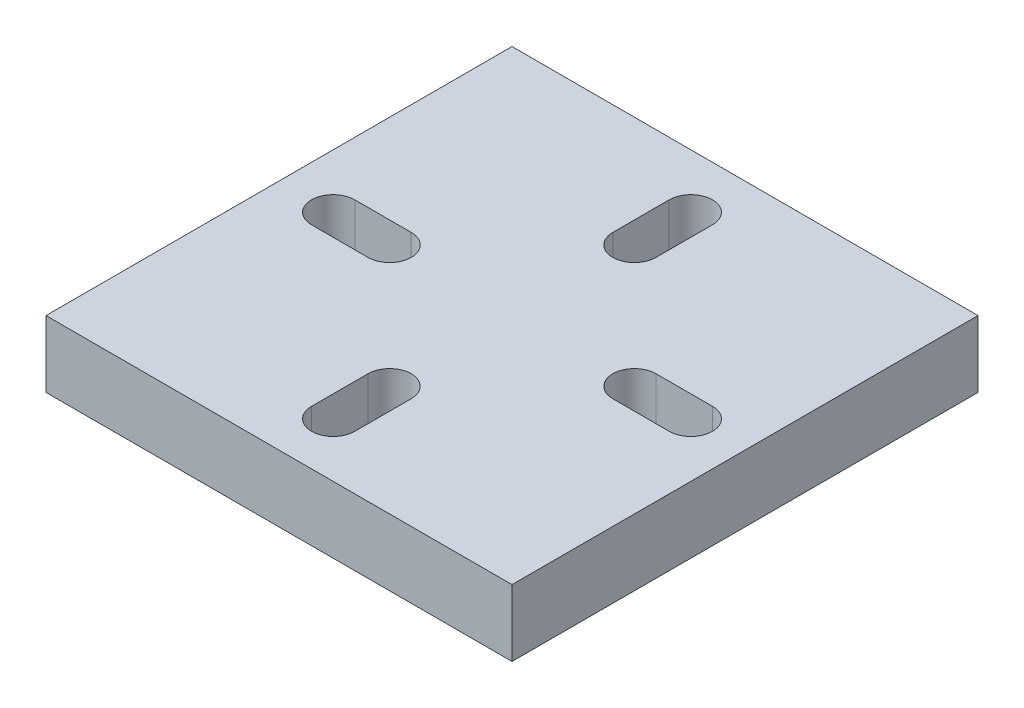
ISO-10303-21;
HEADER;
FILE_DESCRIPTION(('STEP AP214'),'2;1');
FILE_NAME('part.step','',(''),(''),'','','');
FILE_SCHEMA(('AUTOMOTIVE_DESIGN { 1 0 10303 214 1 1 1 1 }'));
ENDSEC;
DATA;
#1=APPLICATION_CONTEXT('core data for automotive mechanical design processes');
#2=APPLICATION_PROTOCOL_DEFINITION('international standard','automotive_design',2000,#1);
#3=PRODUCT_CONTEXT('',#1,'mechanical');
#4=PRODUCT('Part','Part','',(#3));
#5=PRODUCT_RELATED_PRODUCT_CATEGORY('part','',(#4));
#6=PRODUCT_DEFINITION_FORMATION('','',#4);
#7=PRODUCT_DEFINITION_CONTEXT('part definition',#1,'design');
#8=PRODUCT_DEFINITION('design','',#6,#7);
#9=PRODUCT_DEFINITION_SHAPE('','',#8);
#10=(LENGTH_UNIT() NAMED_UNIT(*) SI_UNIT(.MILLI.,.METRE.));
#11=(NAMED_UNIT(*) PLANE_ANGLE_UNIT() SI_UNIT($,.RADIAN.));
#12=(NAMED_UNIT(*) SI_UNIT($,.STERADIAN.) SOLID_ANGLE_UNIT());
#13=UNCERTAINTY_MEASURE_WITH_UNIT(LENGTH_MEASURE(1.E-05),#10,'distance_accuracy_value','');
#14=(GEOMETRIC_REPRESENTATION_CONTEXT(3) GLOBAL_UNCERTAINTY_ASSIGNED_CONTEXT((#13)) GLOBAL_UNIT_ASSIGNED_CONTEXT((#10,
#11,#12)) REPRESENTATION_CONTEXT('',''));
#15=CARTESIAN_POINT('',(0.,0.,0.));
#16=DIRECTION('',(0.,0.,1.));
#17=DIRECTION('',(1.,0.,0.));
#18=AXIS2_PLACEMENT_3D('',#15,#16,#17);
#19=CARTESIAN_POINT('',(35.,10.,-35.));
#20=DIRECTION('',(1.,0.,0.));
#21=DIRECTION('',(0.,0.,-1.));
#22=AXIS2_PLACEMENT_3D('',#19,#20,#21);
#23=PLANE('',#22);
#24=DIRECTION('',(0.,0.,1.));
#25=VECTOR('',#24,1.);
#26=CARTESIAN_POINT('',(35.,0.,-35.));
#27=LINE('',#26,#25);
#28=CARTESIAN_POINT('',(35.,0.,-35.));
#29=VERTEX_POINT('',#28);
#30=CARTESIAN_POINT('',(35.,0.,35.));
#31=VERTEX_POINT('',#30);
#32=EDGE_CURVE('E223',#29,#31,#27,.T.);
#33=ORIENTED_EDGE('',*,*,#32,.F.);
#34=DIRECTION('',(0.,-1.,0.));
#35=VECTOR('',#34,1.);
#36=CARTESIAN_POINT('',(35.,10.,-35.));
#37=LINE('',#36,#35);
#38=CARTESIAN_POINT('',(35.,10.,-35.));
#39=VERTEX_POINT('',#38);
#40=EDGE_CURVE('E11',#39,#29,#37,.T.);
#41=ORIENTED_EDGE('',*,*,#40,.F.);
#42=DIRECTION('',(0.,0.,1.));
#43=VECTOR('',#42,1.);
#44=CARTESIAN_POINT('',(35.,10.,-35.));
#45=LINE('',#44,#43);
#46=CARTESIAN_POINT('',(35.,10.,35.));
#47=VERTEX_POINT('',#46);
#48=EDGE_CURVE('E358',#39,#47,#45,.T.);
#49=ORIENTED_EDGE('',*,*,#48,.T.);
#50=DIRECTION('',(0.,-1.,0.));
#51=VECTOR('',#50,1.);
#52=CARTESIAN_POINT('',(35.,10.,35.));
#53=LINE('',#52,#51);
#54=EDGE_CURVE('E40',#47,#31,#53,.T.);
#55=ORIENTED_EDGE('',*,*,#54,.T.);
#56=EDGE_LOOP('',(#33,#41,#49,#55));
#57=FACE_BOUND('',#56,.T.);
#58=ADVANCED_FACE('F37',(#57),#23,.T.);
#59=CARTESIAN_POINT('',(35.,10.,-35.));
#60=DIRECTION('',(0.,0.,1.));
#61=DIRECTION('',(1.,0.,0.));
#62=AXIS2_PLACEMENT_3D('',#59,#60,#61);
#63=PLANE('',#62);
#64=DIRECTION('',(-1.,0.,0.));
#65=VECTOR('',#64,1.);
#66=CARTESIAN_POINT('',(35.,0.,-35.));
#67=LINE('',#66,#65);
#68=CARTESIAN_POINT('',(-35.,0.,-35.));
#69=VERTEX_POINT('',#68);
#70=EDGE_CURVE('E363',#29,#69,#67,.T.);
#71=ORIENTED_EDGE('',*,*,#70,.T.);
#72=DIRECTION('',(0.,-1.,0.));
#73=VECTOR('',#72,1.);
#74=CARTESIAN_POINT('',(-35.,10.,-35.));
#75=LINE('',#74,#73);
#76=CARTESIAN_POINT('',(-35.,10.,-35.));
#77=VERTEX_POINT('',#76);
#78=EDGE_CURVE('E46',#77,#69,#75,.T.);
#79=ORIENTED_EDGE('',*,*,#78,.F.);
#80=DIRECTION('',(-1.,0.,0.));
#81=VECTOR('',#80,1.);
#82=CARTESIAN_POINT('',(35.,10.,-35.));
#83=LINE('',#82,#81);
#84=EDGE_CURVE('E370',#39,#77,#83,.T.);
#85=ORIENTED_EDGE('',*,*,#84,.F.);
#86=ORIENTED_EDGE('',*,*,#40,.T.);
#87=EDGE_LOOP('',(#71,#79,#85,#86));
#88=FACE_BOUND('',#87,.T.);
#89=ADVANCED_FACE('F406',(#88),#63,.F.);
#90=CARTESIAN_POINT('',(-35.,10.,-35.));
#91=DIRECTION('',(1.,0.,0.));
#92=DIRECTION('',(0.,0.,-1.));
#93=AXIS2_PLACEMENT_3D('',#90,#91,#92);
#94=PLANE('',#93);
#95=DIRECTION('',(0.,0.,1.));
#96=VECTOR('',#95,1.);
#97=CARTESIAN_POINT('',(-35.,0.,-35.));
#98=LINE('',#97,#96);
#99=CARTESIAN_POINT('',(-35.,0.,35.));
#100=VERTEX_POINT('',#99);
#101=EDGE_CURVE('E380',#69,#100,#98,.T.);
#102=ORIENTED_EDGE('',*,*,#101,.T.);
#103=DIRECTION('',(0.,-1.,0.));
#104=VECTOR('',#103,1.);
#105=CARTESIAN_POINT('',(-35.,10.,35.));
#106=LINE('',#105,#104);
#107=CARTESIAN_POINT('',(-35.,10.,35.));
#108=VERTEX_POINT('',#107);
#109=EDGE_CURVE('E388',#108,#100,#106,.T.);
#110=ORIENTED_EDGE('',*,*,#109,.F.);
#111=DIRECTION('',(0.,0.,1.));
#112=VECTOR('',#111,1.);
#113=CARTESIAN_POINT('',(-35.,10.,-35.));
#114=LINE('',#113,#112);
#115=EDGE_CURVE('E367',#77,#108,#114,.T.);
#116=ORIENTED_EDGE('',*,*,#115,.F.);
#117=ORIENTED_EDGE('',*,*,#78,.T.);
#118=EDGE_LOOP('',(#102,#110,#116,#117));
#119=FACE_BOUND('',#118,.T.);
#120=ADVANCED_FACE('F410',(#119),#94,.F.);
#121=CARTESIAN_POINT('',(35.,10.,35.));
#122=DIRECTION('',(0.,0.,1.));
#123=DIRECTION('',(1.,0.,0.));
#124=AXIS2_PLACEMENT_3D('',#121,#122,#123);
#125=PLANE('',#124);
#126=DIRECTION('',(-1.,0.,0.));
#127=VECTOR('',#126,1.);
#128=CARTESIAN_POINT('',(35.,0.,35.));
#129=LINE('',#128,#127);
#130=EDGE_CURVE('E376',#31,#100,#129,.T.);
#131=ORIENTED_EDGE('',*,*,#130,.F.);
#132=ORIENTED_EDGE('',*,*,#54,.F.);
#133=DIRECTION('',(-1.,0.,0.));
#134=VECTOR('',#133,1.);
#135=CARTESIAN_POINT('',(35.,10.,35.));
#136=LINE('',#135,#134);
#137=EDGE_CURVE('E362',#47,#108,#136,.T.);
#138=ORIENTED_EDGE('',*,*,#137,.T.);
#139=ORIENTED_EDGE('',*,*,#109,.T.);
#140=EDGE_LOOP('',(#131,#132,#138,#139));
#141=FACE_BOUND('',#140,.T.);
#142=ADVANCED_FACE('F400',(#141),#125,.T.);
#143=CARTESIAN_POINT('',(0.,10.,0.));
#144=DIRECTION('',(0.,-1.,0.));
#145=DIRECTION('',(0.,0.,-1.));
#146=AXIS2_PLACEMENT_3D('',#143,#144,#145);
#147=PLANE('',#146);
#148=DIRECTION('',(1.,0.,0.));
#149=VECTOR('',#148,1.);
#150=CARTESIAN_POINT('',(-26.8700576850888,10.,3.25));
#151=LINE('',#150,#149);
#152=CARTESIAN_POINT('',(-26.8700576850888,10.,3.25));
#153=VERTEX_POINT('',#152);
#154=CARTESIAN_POINT('',(-18.3847763108502,10.,3.25));
#155=VERTEX_POINT('',#154);
#156=EDGE_CURVE('E214',#153,#155,#151,.T.);
#157=ORIENTED_EDGE('',*,*,#156,.F.);
#158=CARTESIAN_POINT('',(-26.8700576850888,10.,0.));
#159=DIRECTION('',(0.,1.,0.));
#160=DIRECTION('',(0.,0.,1.));
#161=AXIS2_PLACEMENT_3D('',#158,#159,#160);
#162=CIRCLE('',#161,3.25);
#163=CARTESIAN_POINT('',(-26.8700576850888,10.,-3.25));
#164=VERTEX_POINT('',#163);
#165=EDGE_CURVE('E54',#164,#153,#162,.T.);
#166=ORIENTED_EDGE('',*,*,#165,.F.);
#167=DIRECTION('',(-1.,0.,0.));
#168=VECTOR('',#167,1.);
#169=CARTESIAN_POINT('',(-26.8700576850888,10.,-3.25));
#170=LINE('',#169,#168);
#171=CARTESIAN_POINT('',(-18.3847763108502,10.,-3.25000000000001));
#172=VERTEX_POINT('',#171);
#173=EDGE_CURVE('E199',#172,#164,#170,.T.);
#174=ORIENTED_EDGE('',*,*,#173,.F.);
#175=CARTESIAN_POINT('',(-18.3847763108502,10.,0.));
#176=DIRECTION('',(0.,1.,0.));
#177=DIRECTION('',(0.,0.,1.));
#178=AXIS2_PLACEMENT_3D('',#175,#176,#177);
#179=CIRCLE('',#178,3.25);
#180=EDGE_CURVE('E205',#155,#172,#179,.T.);
#181=ORIENTED_EDGE('',*,*,#180,.F.);
#182=EDGE_LOOP('',(#157,#166,#174,#181));
#183=FACE_BOUND('',#182,.T.);
#184=DIRECTION('',(0.,0.,1.));
#185=VECTOR('',#184,1.);
#186=CARTESIAN_POINT('',(-3.25,10.,-26.8700576850888));
#187=LINE('',#186,#185);
#188=CARTESIAN_POINT('',(-3.25,10.,-26.8700576850888));
#189=VERTEX_POINT('',#188);
#190=CARTESIAN_POINT('',(-3.25,10.,-18.3847763108502));
#191=VERTEX_POINT('',#190);
#192=EDGE_CURVE('E249',#189,#191,#187,.T.);
#193=ORIENTED_EDGE('',*,*,#192,.F.);
#194=CARTESIAN_POINT('',(0.,10.,-26.8700576850888));
#195=DIRECTION('',(0.,1.,0.));
#196=DIRECTION('',(0.,0.,1.));
#197=AXIS2_PLACEMENT_3D('',#194,#195,#196);
#198=CIRCLE('',#197,3.25);
#199=CARTESIAN_POINT('',(3.25,10.,-26.8700576850888));
#200=VERTEX_POINT('',#199);
#201=EDGE_CURVE('E62',#200,#189,#198,.T.);
#202=ORIENTED_EDGE('',*,*,#201,.F.);
#203=DIRECTION('',(0.,0.,-1.));
#204=VECTOR('',#203,1.);
#205=CARTESIAN_POINT('',(3.25,10.,-26.8700576850888));
#206=LINE('',#205,#204);
#207=CARTESIAN_POINT('',(3.25000000000001,10.,-18.3847763108502));
#208=VERTEX_POINT('',#207);
#209=EDGE_CURVE('E234',#208,#200,#206,.T.);
#210=ORIENTED_EDGE('',*,*,#209,.F.);
#211=CARTESIAN_POINT('',(0.,10.,-18.3847763108502));
#212=DIRECTION('',(0.,1.,0.));
#213=DIRECTION('',(0.,0.,1.));
#214=AXIS2_PLACEMENT_3D('',#211,#212,#213);
#215=CIRCLE('',#214,3.25);
#216=EDGE_CURVE('E254',#191,#208,#215,.T.);
#217=ORIENTED_EDGE('',*,*,#216,.F.);
#218=EDGE_LOOP('',(#193,#202,#210,#217));
#219=FACE_BOUND('',#218,.T.);
#220=DIRECTION('',(-1.,0.,0.));
#221=VECTOR('',#220,1.);
#222=CARTESIAN_POINT('',(26.8700576850888,10.,-3.25000000000004));
#223=LINE('',#222,#221);
#224=CARTESIAN_POINT('',(26.8700576850888,10.,-3.25000000000004));
#225=VERTEX_POINT('',#224);
#226=CARTESIAN_POINT('',(18.3847763108502,10.,-3.25000000000002));
#227=VERTEX_POINT('',#226);
#228=EDGE_CURVE('E292',#225,#227,#223,.T.);
#229=ORIENTED_EDGE('',*,*,#228,.F.);
#230=CARTESIAN_POINT('',(26.8700576850888,10.,0.));
#231=DIRECTION('',(0.,1.,0.));
#232=DIRECTION('',(0.,0.,1.));
#233=AXIS2_PLACEMENT_3D('',#230,#231,#232);
#234=CIRCLE('',#233,3.25000000000002);
#235=CARTESIAN_POINT('',(26.8700576850888,10.,3.25));
#236=VERTEX_POINT('',#235);
#237=EDGE_CURVE('E289',#236,#225,#234,.T.);
#238=ORIENTED_EDGE('',*,*,#237,.F.);
#239=DIRECTION('',(1.,0.,0.));
#240=VECTOR('',#239,1.);
#241=CARTESIAN_POINT('',(26.8700576850888,10.,3.25));
#242=LINE('',#241,#240);
#243=CARTESIAN_POINT('',(18.3847763108502,10.,3.25));
#244=VERTEX_POINT('',#243);
#245=EDGE_CURVE('E276',#244,#236,#242,.T.);
#246=ORIENTED_EDGE('',*,*,#245,.F.);
#247=CARTESIAN_POINT('',(18.3847763108502,10.,0.));
#248=DIRECTION('',(0.,1.,0.));
#249=DIRECTION('',(0.,0.,1.));
#250=AXIS2_PLACEMENT_3D('',#247,#248,#249);
#251=CIRCLE('',#250,3.25000000000002);
#252=EDGE_CURVE('E297',#227,#244,#251,.T.);
#253=ORIENTED_EDGE('',*,*,#252,.F.);
#254=EDGE_LOOP('',(#229,#238,#246,#253));
#255=FACE_BOUND('',#254,.T.);
#256=DIRECTION('',(0.,0.,-1.));
#257=VECTOR('',#256,1.);
#258=CARTESIAN_POINT('',(3.25000000000001,10.,26.8700576850888));
#259=LINE('',#258,#257);
#260=CARTESIAN_POINT('',(3.25000000000001,10.,26.8700576850888));
#261=VERTEX_POINT('',#260);
#262=CARTESIAN_POINT('',(3.25,10.,18.3847763108502));
#263=VERTEX_POINT('',#262);
#264=EDGE_CURVE('E336',#261,#263,#259,.T.);
#265=ORIENTED_EDGE('',*,*,#264,.F.);
#266=CARTESIAN_POINT('',(0.,10.,26.8700576850888));
#267=DIRECTION('',(0.,1.,0.));
#268=DIRECTION('',(0.,0.,1.));
#269=AXIS2_PLACEMENT_3D('',#266,#267,#268);
#270=CIRCLE('',#269,3.25000000000001);
#271=CARTESIAN_POINT('',(-3.25000000000001,10.,26.8700576850888));
#272=VERTEX_POINT('',#271);
#273=EDGE_CURVE('E333',#272,#261,#270,.T.);
#274=ORIENTED_EDGE('',*,*,#273,.F.);
#275=DIRECTION('',(0.,0.,1.));
#276=VECTOR('',#275,1.);
#277=CARTESIAN_POINT('',(-3.25000000000001,10.,26.8700576850888));
#278=LINE('',#277,#276);
#279=CARTESIAN_POINT('',(-3.25000000000001,10.,18.3847763108502));
#280=VERTEX_POINT('',#279);
#281=EDGE_CURVE('E320',#280,#272,#278,.T.);
#282=ORIENTED_EDGE('',*,*,#281,.F.);
#283=CARTESIAN_POINT('',(0.,10.,18.3847763108502));
#284=DIRECTION('',(0.,1.,0.));
#285=DIRECTION('',(0.,0.,1.));
#286=AXIS2_PLACEMENT_3D('',#283,#284,#285);
#287=CIRCLE('',#286,3.25000000000001);
#288=EDGE_CURVE('E340',#263,#280,#287,.T.);
#289=ORIENTED_EDGE('',*,*,#288,.F.);
#290=EDGE_LOOP('',(#265,#274,#282,#289));
#291=FACE_BOUND('',#290,.T.);
#292=ORIENTED_EDGE('',*,*,#48,.F.);
#293=ORIENTED_EDGE('',*,*,#84,.T.);
#294=ORIENTED_EDGE('',*,*,#115,.T.);
#295=ORIENTED_EDGE('',*,*,#137,.F.);
#296=EDGE_LOOP('',(#292,#293,#294,#295));
#297=FACE_BOUND('',#296,.T.);
#298=ADVANCED_FACE('F412',(#183,#219,#255,#291,#297),#147,.F.);
#299=CARTESIAN_POINT('',(0.,0.,0.));
#300=DIRECTION('',(0.,-1.,0.));
#301=DIRECTION('',(0.,0.,-1.));
#302=AXIS2_PLACEMENT_3D('',#299,#300,#301);
#303=PLANE('',#302);
#304=CARTESIAN_POINT('',(-26.8700576850888,0.,0.));
#305=DIRECTION('',(0.,1.,0.));
#306=DIRECTION('',(0.,0.,1.));
#307=AXIS2_PLACEMENT_3D('',#304,#305,#306);
#308=CIRCLE('',#307,3.25);
#309=CARTESIAN_POINT('',(-26.8700576850888,0.,-3.25));
#310=VERTEX_POINT('',#309);
#311=CARTESIAN_POINT('',(-26.8700576850888,0.,3.25));
#312=VERTEX_POINT('',#311);
#313=EDGE_CURVE('E177',#310,#312,#308,.T.);
#314=ORIENTED_EDGE('',*,*,#313,.T.);
#315=DIRECTION('',(1.,0.,0.));
#316=VECTOR('',#315,1.);
#317=CARTESIAN_POINT('',(-26.8700576850888,0.,3.25));
#318=LINE('',#317,#316);
#319=CARTESIAN_POINT('',(-18.3847763108502,0.,3.24999999999999));
#320=VERTEX_POINT('',#319);
#321=EDGE_CURVE('E188',#312,#320,#318,.T.);
#322=ORIENTED_EDGE('',*,*,#321,.T.);
#323=CARTESIAN_POINT('',(-18.3847763108502,0.,0.));
#324=DIRECTION('',(0.,1.,0.));
#325=DIRECTION('',(0.,0.,1.));
#326=AXIS2_PLACEMENT_3D('',#323,#324,#325);
#327=CIRCLE('',#326,3.25);
#328=CARTESIAN_POINT('',(-18.3847763108502,0.,-3.25000000000001));
#329=VERTEX_POINT('',#328);
#330=EDGE_CURVE('E193',#320,#329,#327,.T.);
#331=ORIENTED_EDGE('',*,*,#330,.T.);
#332=DIRECTION('',(-1.,0.,0.));
#333=VECTOR('',#332,1.);
#334=CARTESIAN_POINT('',(-26.8700576850888,0.,-3.25));
#335=LINE('',#334,#333);
#336=EDGE_CURVE('E184',#329,#310,#335,.T.);
#337=ORIENTED_EDGE('',*,*,#336,.T.);
#338=EDGE_LOOP('',(#314,#322,#331,#337));
#339=FACE_BOUND('',#338,.T.);
#340=CARTESIAN_POINT('',(0.,0.,-26.8700576850888));
#341=DIRECTION('',(0.,1.,0.));
#342=DIRECTION('',(0.,0.,1.));
#343=AXIS2_PLACEMENT_3D('',#340,#341,#342);
#344=CIRCLE('',#343,3.25);
#345=CARTESIAN_POINT('',(3.25,0.,-26.8700576850888));
#346=VERTEX_POINT('',#345);
#347=CARTESIAN_POINT('',(-3.25,0.,-26.8700576850888));
#348=VERTEX_POINT('',#347);
#349=EDGE_CURVE('E229',#346,#348,#344,.T.);
#350=ORIENTED_EDGE('',*,*,#349,.T.);
#351=DIRECTION('',(0.,0.,1.));
#352=VECTOR('',#351,1.);
#353=CARTESIAN_POINT('',(-3.25,0.,-26.8700576850888));
#354=LINE('',#353,#352);
#355=CARTESIAN_POINT('',(-3.25,0.,-18.3847763108502));
#356=VERTEX_POINT('',#355);
#357=EDGE_CURVE('E233',#348,#356,#354,.T.);
#358=ORIENTED_EDGE('',*,*,#357,.T.);
#359=CARTESIAN_POINT('',(0.,0.,-18.3847763108502));
#360=DIRECTION('',(0.,1.,0.));
#361=DIRECTION('',(0.,0.,1.));
#362=AXIS2_PLACEMENT_3D('',#359,#360,#361);
#363=CIRCLE('',#362,3.25);
#364=CARTESIAN_POINT('',(3.25000000000001,0.,-18.3847763108502));
#365=VERTEX_POINT('',#364);
#366=EDGE_CURVE('E238',#356,#365,#363,.T.);
#367=ORIENTED_EDGE('',*,*,#366,.T.);
#368=DIRECTION('',(0.,0.,-1.));
#369=VECTOR('',#368,1.);
#370=CARTESIAN_POINT('',(3.25,0.,-26.8700576850888));
#371=LINE('',#370,#369);
#372=EDGE_CURVE('E242',#365,#346,#371,.T.);
#373=ORIENTED_EDGE('',*,*,#372,.T.);
#374=EDGE_LOOP('',(#350,#358,#367,#373));
#375=FACE_BOUND('',#374,.T.);
#376=CARTESIAN_POINT('',(26.8700576850888,0.,0.));
#377=DIRECTION('',(0.,1.,0.));
#378=DIRECTION('',(0.,0.,1.));
#379=AXIS2_PLACEMENT_3D('',#376,#377,#378);
#380=CIRCLE('',#379,3.25000000000002);
#381=CARTESIAN_POINT('',(26.8700576850888,0.,3.25));
#382=VERTEX_POINT('',#381);
#383=CARTESIAN_POINT('',(26.8700576850888,0.,-3.25000000000004));
#384=VERTEX_POINT('',#383);
#385=EDGE_CURVE('E271',#382,#384,#380,.T.);
#386=ORIENTED_EDGE('',*,*,#385,.T.);
#387=DIRECTION('',(-1.,0.,0.));
#388=VECTOR('',#387,1.);
#389=CARTESIAN_POINT('',(26.8700576850888,0.,-3.25000000000004));
#390=LINE('',#389,#388);
#391=CARTESIAN_POINT('',(18.3847763108502,0.,-3.25000000000004));
#392=VERTEX_POINT('',#391);
#393=EDGE_CURVE('E275',#384,#392,#390,.T.);
#394=ORIENTED_EDGE('',*,*,#393,.T.);
#395=CARTESIAN_POINT('',(18.3847763108502,0.,0.));
#396=DIRECTION('',(0.,1.,0.));
#397=DIRECTION('',(0.,0.,1.));
#398=AXIS2_PLACEMENT_3D('',#395,#396,#397);
#399=CIRCLE('',#398,3.25000000000002);
#400=CARTESIAN_POINT('',(18.3847763108502,0.,3.25));
#401=VERTEX_POINT('',#400);
#402=EDGE_CURVE('E280',#392,#401,#399,.T.);
#403=ORIENTED_EDGE('',*,*,#402,.T.);
#404=DIRECTION('',(1.,0.,0.));
#405=VECTOR('',#404,1.);
#406=CARTESIAN_POINT('',(26.8700576850888,0.,3.25));
#407=LINE('',#406,#405);
#408=EDGE_CURVE('E284',#401,#382,#407,.T.);
#409=ORIENTED_EDGE('',*,*,#408,.T.);
#410=EDGE_LOOP('',(#386,#394,#403,#409));
#411=FACE_BOUND('',#410,.T.);
#412=CARTESIAN_POINT('',(0.,0.,26.8700576850888));
#413=DIRECTION('',(0.,1.,0.));
#414=DIRECTION('',(0.,0.,1.));
#415=AXIS2_PLACEMENT_3D('',#412,#413,#414);
#416=CIRCLE('',#415,3.25000000000001);
#417=CARTESIAN_POINT('',(-3.25000000000001,0.,26.8700576850888));
#418=VERTEX_POINT('',#417);
#419=CARTESIAN_POINT('',(3.25000000000001,0.,26.8700576850888));
#420=VERTEX_POINT('',#419);
#421=EDGE_CURVE('E315',#418,#420,#416,.T.);
#422=ORIENTED_EDGE('',*,*,#421,.T.);
#423=DIRECTION('',(0.,0.,-1.));
#424=VECTOR('',#423,1.);
#425=CARTESIAN_POINT('',(3.25000000000001,0.,26.8700576850888));
#426=LINE('',#425,#424);
#427=CARTESIAN_POINT('',(3.25000000000001,0.,18.3847763108502));
#428=VERTEX_POINT('',#427);
#429=EDGE_CURVE('E319',#420,#428,#426,.T.);
#430=ORIENTED_EDGE('',*,*,#429,.T.);
#431=CARTESIAN_POINT('',(0.,0.,18.3847763108502));
#432=DIRECTION('',(0.,1.,0.));
#433=DIRECTION('',(0.,0.,1.));
#434=AXIS2_PLACEMENT_3D('',#431,#432,#433);
#435=CIRCLE('',#434,3.25000000000001);
#436=CARTESIAN_POINT('',(-3.25000000000001,0.,18.3847763108502));
#437=VERTEX_POINT('',#436);
#438=EDGE_CURVE('E324',#428,#437,#435,.T.);
#439=ORIENTED_EDGE('',*,*,#438,.T.);
#440=DIRECTION('',(0.,0.,1.));
#441=VECTOR('',#440,1.);
#442=CARTESIAN_POINT('',(-3.25000000000001,0.,26.8700576850888));
#443=LINE('',#442,#441);
#444=EDGE_CURVE('E328',#437,#418,#443,.T.);
#445=ORIENTED_EDGE('',*,*,#444,.T.);
#446=EDGE_LOOP('',(#422,#430,#439,#445));
#447=FACE_BOUND('',#446,.T.);
#448=ORIENTED_EDGE('',*,*,#32,.T.);
#449=ORIENTED_EDGE('',*,*,#130,.T.);
#450=ORIENTED_EDGE('',*,*,#101,.F.);
#451=ORIENTED_EDGE('',*,*,#70,.F.);
#452=EDGE_LOOP('',(#448,#449,#450,#451));
#453=FACE_BOUND('',#452,.T.);
#454=ADVANCED_FACE('F195',(#339,#375,#411,#447,#453),#303,.T.);
#455=CARTESIAN_POINT('',(0.,0.,26.8700576850888));
#456=DIRECTION('',(0.,1.,0.));
#457=DIRECTION('',(0.,0.,1.));
#458=AXIS2_PLACEMENT_3D('',#455,#456,#457);
#459=CYLINDRICAL_SURFACE('',#458,3.25000000000001);
#460=ORIENTED_EDGE('',*,*,#273,.T.);
#461=DIRECTION('',(0.,1.,0.));
#462=VECTOR('',#461,1.);
#463=CARTESIAN_POINT('',(3.25000000000001,0.,26.8700576850888));
#464=LINE('',#463,#462);
#465=EDGE_CURVE('E332',#420,#261,#464,.T.);
#466=ORIENTED_EDGE('',*,*,#465,.F.);
#467=ORIENTED_EDGE('',*,*,#421,.F.);
#468=DIRECTION('',(0.,1.,0.));
#469=VECTOR('',#468,1.);
#470=CARTESIAN_POINT('',(-3.25000000000001,0.,26.8700576850888));
#471=LINE('',#470,#469);
#472=EDGE_CURVE('E293',#418,#272,#471,.T.);
#473=ORIENTED_EDGE('',*,*,#472,.T.);
#474=EDGE_LOOP('',(#460,#466,#467,#473));
#475=FACE_BOUND('',#474,.T.);
#476=ADVANCED_FACE('F420',(#475),#459,.F.);
#477=CARTESIAN_POINT('',(-3.25000000000001,0.,26.8700576850888));
#478=DIRECTION('',(-1.,0.,0.));
#479=DIRECTION('',(0.,0.,1.));
#480=AXIS2_PLACEMENT_3D('',#477,#478,#479);
#481=PLANE('',#480);
#482=ORIENTED_EDGE('',*,*,#281,.T.);
#483=ORIENTED_EDGE('',*,*,#472,.F.);
#484=ORIENTED_EDGE('',*,*,#444,.F.);
#485=DIRECTION('',(0.,1.,0.));
#486=VECTOR('',#485,1.);
#487=CARTESIAN_POINT('',(-3.25000000000001,0.,18.3847763108502));
#488=LINE('',#487,#486);
#489=EDGE_CURVE('E349',#437,#280,#488,.T.);
#490=ORIENTED_EDGE('',*,*,#489,.T.);
#491=EDGE_LOOP('',(#482,#483,#484,#490));
#492=FACE_BOUND('',#491,.T.);
#493=ADVANCED_FACE('F457',(#492),#481,.F.);
#494=CARTESIAN_POINT('',(0.,0.,18.3847763108502));
#495=DIRECTION('',(0.,1.,0.));
#496=DIRECTION('',(0.,0.,1.));
#497=AXIS2_PLACEMENT_3D('',#494,#495,#496);
#498=CYLINDRICAL_SURFACE('',#497,3.25000000000001);
#499=ORIENTED_EDGE('',*,*,#288,.T.);
#500=ORIENTED_EDGE('',*,*,#489,.F.);
#501=ORIENTED_EDGE('',*,*,#438,.F.);
#502=DIRECTION('',(0.,1.,0.));
#503=VECTOR('',#502,1.);
#504=CARTESIAN_POINT('',(3.25,0.,18.3847763108502));
#505=LINE('',#504,#503);
#506=EDGE_CURVE('E352',#428,#263,#505,.T.);
#507=ORIENTED_EDGE('',*,*,#506,.T.);
#508=EDGE_LOOP('',(#499,#500,#501,#507));
#509=FACE_BOUND('',#508,.T.);
#510=ADVANCED_FACE('F464',(#509),#498,.F.);
#511=CARTESIAN_POINT('',(3.25000000000001,0.,26.8700576850888));
#512=DIRECTION('',(1.,0.,0.));
#513=DIRECTION('',(0.,0.,-1.));
#514=AXIS2_PLACEMENT_3D('',#511,#512,#513);
#515=PLANE('',#514);
#516=ORIENTED_EDGE('',*,*,#264,.T.);
#517=ORIENTED_EDGE('',*,*,#506,.F.);
#518=ORIENTED_EDGE('',*,*,#429,.F.);
#519=ORIENTED_EDGE('',*,*,#465,.T.);
#520=EDGE_LOOP('',(#516,#517,#518,#519));
#521=FACE_BOUND('',#520,.T.);
#522=ADVANCED_FACE('F472',(#521),#515,.F.);
#523=CARTESIAN_POINT('',(26.8700576850888,0.,0.));
#524=DIRECTION('',(0.,1.,0.));
#525=DIRECTION('',(0.,0.,1.));
#526=AXIS2_PLACEMENT_3D('',#523,#524,#525);
#527=CYLINDRICAL_SURFACE('',#526,3.25000000000002);
#528=ORIENTED_EDGE('',*,*,#237,.T.);
#529=DIRECTION('',(0.,1.,0.));
#530=VECTOR('',#529,1.);
#531=CARTESIAN_POINT('',(26.8700576850888,0.,-3.25000000000004));
#532=LINE('',#531,#530);
#533=EDGE_CURVE('E288',#384,#225,#532,.T.);
#534=ORIENTED_EDGE('',*,*,#533,.F.);
#535=ORIENTED_EDGE('',*,*,#385,.F.);
#536=DIRECTION('',(0.,1.,0.));
#537=VECTOR('',#536,1.);
#538=CARTESIAN_POINT('',(26.8700576850888,0.,3.25));
#539=LINE('',#538,#537);
#540=EDGE_CURVE('E250',#382,#236,#539,.T.);
#541=ORIENTED_EDGE('',*,*,#540,.T.);
#542=EDGE_LOOP('',(#528,#534,#535,#541));
#543=FACE_BOUND('',#542,.T.);
#544=ADVANCED_FACE('F480',(#543),#527,.F.);
#545=CARTESIAN_POINT('',(26.8700576850888,0.,3.25));
#546=DIRECTION('',(0.,0.,1.));
#547=DIRECTION('',(1.,0.,0.));
#548=AXIS2_PLACEMENT_3D('',#545,#546,#547);
#549=PLANE('',#548);
#550=ORIENTED_EDGE('',*,*,#245,.T.);
#551=ORIENTED_EDGE('',*,*,#540,.F.);
#552=ORIENTED_EDGE('',*,*,#408,.F.);
#553=DIRECTION('',(0.,1.,0.));
#554=VECTOR('',#553,1.);
#555=CARTESIAN_POINT('',(18.3847763108502,0.,3.25));
#556=LINE('',#555,#554);
#557=EDGE_CURVE('E306',#401,#244,#556,.T.);
#558=ORIENTED_EDGE('',*,*,#557,.T.);
#559=EDGE_LOOP('',(#550,#551,#552,#558));
#560=FACE_BOUND('',#559,.T.);
#561=ADVANCED_FACE('F488',(#560),#549,.F.);
#562=CARTESIAN_POINT('',(18.3847763108502,0.,0.));
#563=DIRECTION('',(0.,1.,0.));
#564=DIRECTION('',(0.,0.,1.));
#565=AXIS2_PLACEMENT_3D('',#562,#563,#564);
#566=CYLINDRICAL_SURFACE('',#565,3.25000000000002);
#567=ORIENTED_EDGE('',*,*,#252,.T.);
#568=ORIENTED_EDGE('',*,*,#557,.F.);
#569=ORIENTED_EDGE('',*,*,#402,.F.);
#570=DIRECTION('',(0.,1.,0.));
#571=VECTOR('',#570,1.);
#572=CARTESIAN_POINT('',(18.3847763108502,0.,-3.25000000000002));
#573=LINE('',#572,#571);
#574=EDGE_CURVE('E309',#392,#227,#573,.T.);
#575=ORIENTED_EDGE('',*,*,#574,.T.);
#576=EDGE_LOOP('',(#567,#568,#569,#575));
#577=FACE_BOUND('',#576,.T.);
#578=ADVANCED_FACE('F496',(#577),#566,.F.);
#579=CARTESIAN_POINT('',(26.8700576850888,0.,-3.25000000000004));
#580=DIRECTION('',(0.,0.,-1.));
#581=DIRECTION('',(-1.,0.,0.));
#582=AXIS2_PLACEMENT_3D('',#579,#580,#581);
#583=PLANE('',#582);
#584=ORIENTED_EDGE('',*,*,#228,.T.);
#585=ORIENTED_EDGE('',*,*,#574,.F.);
#586=ORIENTED_EDGE('',*,*,#393,.F.);
#587=ORIENTED_EDGE('',*,*,#533,.T.);
#588=EDGE_LOOP('',(#584,#585,#586,#587));
#589=FACE_BOUND('',#588,.T.);
#590=ADVANCED_FACE('F504',(#589),#583,.F.);
#591=CARTESIAN_POINT('',(0.,0.,-26.8700576850888));
#592=DIRECTION('',(0.,1.,0.));
#593=DIRECTION('',(0.,0.,1.));
#594=AXIS2_PLACEMENT_3D('',#591,#592,#593);
#595=CYLINDRICAL_SURFACE('',#594,3.25);
#596=ORIENTED_EDGE('',*,*,#201,.T.);
#597=DIRECTION('',(0.,1.,0.));
#598=VECTOR('',#597,1.);
#599=CARTESIAN_POINT('',(-3.25,0.,-26.8700576850888));
#600=LINE('',#599,#598);
#601=EDGE_CURVE('E246',#348,#189,#600,.T.);
#602=ORIENTED_EDGE('',*,*,#601,.F.);
#603=ORIENTED_EDGE('',*,*,#349,.F.);
#604=DIRECTION('',(0.,1.,0.));
#605=VECTOR('',#604,1.);
#606=CARTESIAN_POINT('',(3.25,0.,-26.8700576850888));
#607=LINE('',#606,#605);
#608=EDGE_CURVE('E215',#346,#200,#607,.T.);
#609=ORIENTED_EDGE('',*,*,#608,.T.);
#610=EDGE_LOOP('',(#596,#602,#603,#609));
#611=FACE_BOUND('',#610,.T.);
#612=ADVANCED_FACE('F512',(#611),#595,.F.);
#613=CARTESIAN_POINT('',(3.25,0.,-26.8700576850888));
#614=DIRECTION('',(1.,0.,0.));
#615=DIRECTION('',(0.,0.,-1.));
#616=AXIS2_PLACEMENT_3D('',#613,#614,#615);
#617=PLANE('',#616);
#618=ORIENTED_EDGE('',*,*,#209,.T.);
#619=ORIENTED_EDGE('',*,*,#608,.F.);
#620=ORIENTED_EDGE('',*,*,#372,.F.);
#621=DIRECTION('',(0.,1.,0.));
#622=VECTOR('',#621,1.);
#623=CARTESIAN_POINT('',(3.25000000000001,0.,-18.3847763108502));
#624=LINE('',#623,#622);
#625=EDGE_CURVE('E263',#365,#208,#624,.T.);
#626=ORIENTED_EDGE('',*,*,#625,.T.);
#627=EDGE_LOOP('',(#618,#619,#620,#626));
#628=FACE_BOUND('',#627,.T.);
#629=ADVANCED_FACE('F520',(#628),#617,.F.);
#630=CARTESIAN_POINT('',(0.,0.,-18.3847763108502));
#631=DIRECTION('',(0.,1.,0.));
#632=DIRECTION('',(0.,0.,1.));
#633=AXIS2_PLACEMENT_3D('',#630,#631,#632);
#634=CYLINDRICAL_SURFACE('',#633,3.25);
#635=ORIENTED_EDGE('',*,*,#216,.T.);
#636=ORIENTED_EDGE('',*,*,#625,.F.);
#637=ORIENTED_EDGE('',*,*,#366,.F.);
#638=DIRECTION('',(0.,1.,0.));
#639=VECTOR('',#638,1.);
#640=CARTESIAN_POINT('',(-3.25,0.,-18.3847763108502));
#641=LINE('',#640,#639);
#642=EDGE_CURVE('E266',#356,#191,#641,.T.);
#643=ORIENTED_EDGE('',*,*,#642,.T.);
#644=EDGE_LOOP('',(#635,#636,#637,#643));
#645=FACE_BOUND('',#644,.T.);
#646=ADVANCED_FACE('F527',(#645),#634,.F.);
#647=CARTESIAN_POINT('',(-3.25,0.,-26.8700576850888));
#648=DIRECTION('',(-1.,0.,0.));
#649=DIRECTION('',(0.,0.,1.));
#650=AXIS2_PLACEMENT_3D('',#647,#648,#649);
#651=PLANE('',#650);
#652=ORIENTED_EDGE('',*,*,#192,.T.);
#653=ORIENTED_EDGE('',*,*,#642,.F.);
#654=ORIENTED_EDGE('',*,*,#357,.F.);
#655=ORIENTED_EDGE('',*,*,#601,.T.);
#656=EDGE_LOOP('',(#652,#653,#654,#655));
#657=FACE_BOUND('',#656,.T.);
#658=ADVANCED_FACE('F535',(#657),#651,.F.);
#659=CARTESIAN_POINT('',(-26.8700576850888,0.,0.));
#660=DIRECTION('',(0.,1.,0.));
#661=DIRECTION('',(0.,0.,1.));
#662=AXIS2_PLACEMENT_3D('',#659,#660,#661);
#663=CYLINDRICAL_SURFACE('',#662,3.25);
#664=ORIENTED_EDGE('',*,*,#165,.T.);
#665=DIRECTION('',(0.,1.,0.));
#666=VECTOR('',#665,1.);
#667=CARTESIAN_POINT('',(-26.8700576850888,0.,3.25));
#668=LINE('',#667,#666);
#669=EDGE_CURVE('E173',#312,#153,#668,.T.);
#670=ORIENTED_EDGE('',*,*,#669,.F.);
#671=ORIENTED_EDGE('',*,*,#313,.F.);
#672=DIRECTION('',(0.,1.,0.));
#673=VECTOR('',#672,1.);
#674=CARTESIAN_POINT('',(-26.8700576850888,0.,-3.25));
#675=LINE('',#674,#673);
#676=EDGE_CURVE('E221',#310,#164,#675,.T.);
#677=ORIENTED_EDGE('',*,*,#676,.T.);
#678=EDGE_LOOP('',(#664,#670,#671,#677));
#679=FACE_BOUND('',#678,.T.);
#680=ADVANCED_FACE('F175',(#679),#663,.F.);
#681=CARTESIAN_POINT('',(-26.8700576850888,0.,-3.25));
#682=DIRECTION('',(0.,0.,-1.));
#683=DIRECTION('',(-1.,0.,0.));
#684=AXIS2_PLACEMENT_3D('',#681,#682,#683);
#685=PLANE('',#684);
#686=ORIENTED_EDGE('',*,*,#173,.T.);
#687=ORIENTED_EDGE('',*,*,#676,.F.);
#688=ORIENTED_EDGE('',*,*,#336,.F.);
#689=DIRECTION('',(0.,1.,0.));
#690=VECTOR('',#689,1.);
#691=CARTESIAN_POINT('',(-18.3847763108502,0.,-3.25000000000001));
#692=LINE('',#691,#690);
#693=EDGE_CURVE('E224',#329,#172,#692,.T.);
#694=ORIENTED_EDGE('',*,*,#693,.T.);
#695=EDGE_LOOP('',(#686,#687,#688,#694));
#696=FACE_BOUND('',#695,.T.);
#697=ADVANCED_FACE('F550',(#696),#685,.F.);
#698=CARTESIAN_POINT('',(-18.3847763108502,0.,0.));
#699=DIRECTION('',(0.,1.,0.));
#700=DIRECTION('',(0.,0.,1.));
#701=AXIS2_PLACEMENT_3D('',#698,#699,#700);
#702=CYLINDRICAL_SURFACE('',#701,3.25);
#703=ORIENTED_EDGE('',*,*,#180,.T.);
#704=ORIENTED_EDGE('',*,*,#693,.F.);
#705=ORIENTED_EDGE('',*,*,#330,.F.);
#706=DIRECTION('',(0.,1.,0.));
#707=VECTOR('',#706,1.);
#708=CARTESIAN_POINT('',(-18.3847763108502,0.,3.25));
#709=LINE('',#708,#707);
#710=EDGE_CURVE('E183',#320,#155,#709,.T.);
#711=ORIENTED_EDGE('',*,*,#710,.T.);
#712=EDGE_LOOP('',(#703,#704,#705,#711));
#713=FACE_BOUND('',#712,.T.);
#714=ADVANCED_FACE('F557',(#713),#702,.F.);
#715=CARTESIAN_POINT('',(-26.8700576850888,0.,3.25));
#716=DIRECTION('',(0.,0.,1.));
#717=DIRECTION('',(1.,0.,0.));
#718=AXIS2_PLACEMENT_3D('',#715,#716,#717);
#719=PLANE('',#718);
#720=ORIENTED_EDGE('',*,*,#156,.T.);
#721=ORIENTED_EDGE('',*,*,#710,.F.);
#722=ORIENTED_EDGE('',*,*,#321,.F.);
#723=ORIENTED_EDGE('',*,*,#669,.T.);
#724=EDGE_LOOP('',(#720,#721,#722,#723));
#725=FACE_BOUND('',#724,.T.);
#726=ADVANCED_FACE('F189',(#725),#719,.F.);
#727=CLOSED_SHELL('',(#58,#89,#120,#142,#298,#454,#476,#493,#510,#522,#544,#561,#578,#590,#612,
#629,#646,#658,#680,#697,#714,#726));
#728=MANIFOLD_SOLID_BREP('B2',#727);
#729=ADVANCED_BREP_SHAPE_REPRESENTATION('',(#18,#728),#14);
#730=SHAPE_DEFINITION_REPRESENTATION(#9,#729);
ENDSEC;
END-ISO-10303-21;
